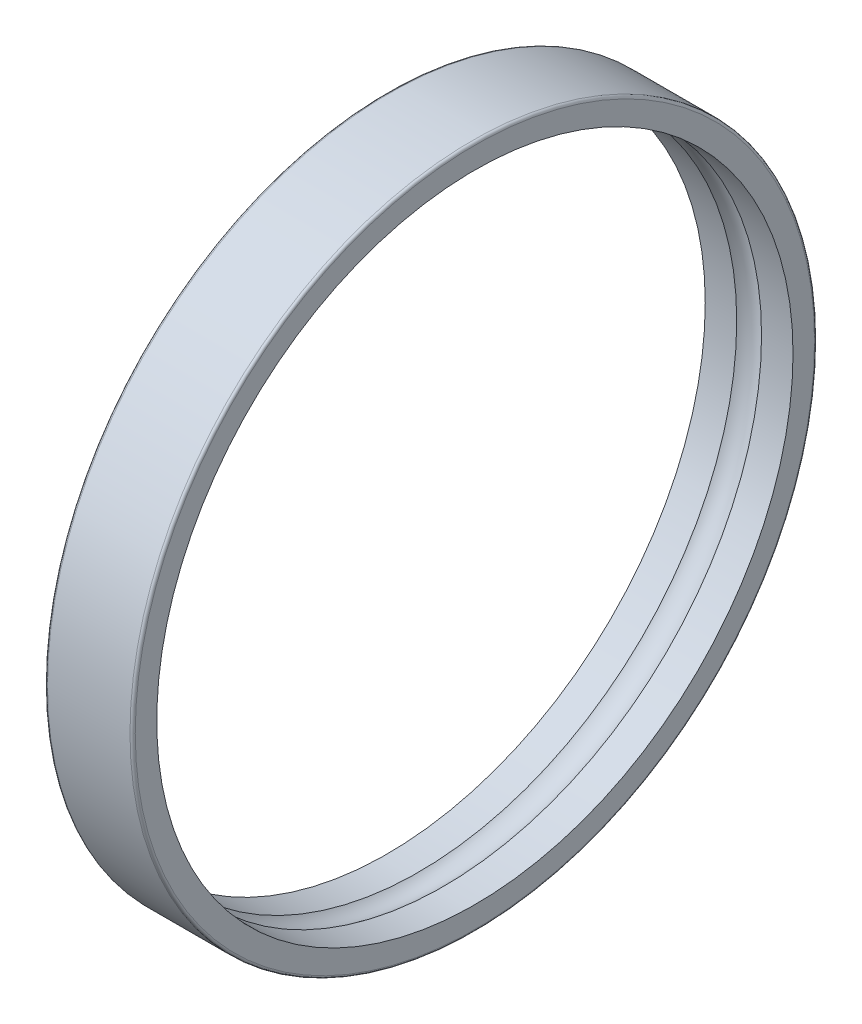
ISO-10303-21;
HEADER;
FILE_DESCRIPTION(('STEP AP214'),'2;1');
FILE_NAME('part.step','',(''),(''),'','','');
FILE_SCHEMA(('AUTOMOTIVE_DESIGN { 1 0 10303 214 1 1 1 1 }'));
ENDSEC;
DATA;
#1=APPLICATION_CONTEXT('core data for automotive mechanical design processes');
#2=APPLICATION_PROTOCOL_DEFINITION('international standard','automotive_design',2000,#1);
#3=PRODUCT_CONTEXT('',#1,'mechanical');
#4=PRODUCT('Part','Part','',(#3));
#5=PRODUCT_RELATED_PRODUCT_CATEGORY('part','',(#4));
#6=PRODUCT_DEFINITION_FORMATION('','',#4);
#7=PRODUCT_DEFINITION_CONTEXT('part definition',#1,'design');
#8=PRODUCT_DEFINITION('design','',#6,#7);
#9=PRODUCT_DEFINITION_SHAPE('','',#8);
#10=(LENGTH_UNIT() NAMED_UNIT(*) SI_UNIT(.MILLI.,.METRE.));
#11=(NAMED_UNIT(*) PLANE_ANGLE_UNIT() SI_UNIT($,.RADIAN.));
#12=(NAMED_UNIT(*) SI_UNIT($,.STERADIAN.) SOLID_ANGLE_UNIT());
#13=UNCERTAINTY_MEASURE_WITH_UNIT(LENGTH_MEASURE(1.E-05),#10,'distance_accuracy_value','');
#14=(GEOMETRIC_REPRESENTATION_CONTEXT(3) GLOBAL_UNCERTAINTY_ASSIGNED_CONTEXT((#13)) GLOBAL_UNIT_ASSIGNED_CONTEXT((#10,
#11,#12)) REPRESENTATION_CONTEXT('',''));
#15=CARTESIAN_POINT('',(0.,0.,0.));
#16=DIRECTION('',(0.,0.,1.));
#17=DIRECTION('',(1.,0.,0.));
#18=AXIS2_PLACEMENT_3D('',#15,#16,#17);
#19=CARTESIAN_POINT('',(0.,38.7,0.));
#20=DIRECTION('',(-1.,0.,0.));
#21=DIRECTION('',(0.,0.,1.));
#22=AXIS2_PLACEMENT_3D('',#19,#20,#21);
#23=PLANE('',#22);
#24=CARTESIAN_POINT('',(0.,0.,0.));
#25=DIRECTION('',(1.,0.,0.));
#26=DIRECTION('',(0.,0.,-1.));
#27=AXIS2_PLACEMENT_3D('',#24,#25,#26);
#28=CIRCLE('',#27,36.25);
#29=CARTESIAN_POINT('',(0.,0.,-36.25));
#30=VERTEX_POINT('',#29);
#31=EDGE_CURVE('E42',#30,#30,#28,.T.);
#32=ORIENTED_EDGE('',*,*,#31,.T.);
#33=EDGE_LOOP('',(#32));
#34=FACE_BOUND('',#33,.T.);
#35=CARTESIAN_POINT('',(0.,0.,0.));
#36=DIRECTION('',(1.,0.,0.));
#37=DIRECTION('',(0.,0.,-1.));
#38=AXIS2_PLACEMENT_3D('',#35,#36,#37);
#39=CIRCLE('',#38,38.7);
#40=CARTESIAN_POINT('',(0.,0.,-38.7));
#41=VERTEX_POINT('',#40);
#42=EDGE_CURVE('E41',#41,#41,#39,.T.);
#43=ORIENTED_EDGE('',*,*,#42,.F.);
#44=EDGE_LOOP('',(#43));
#45=FACE_BOUND('',#44,.T.);
#46=ADVANCED_FACE('F15',(#34,#45),#23,.T.);
#47=CARTESIAN_POINT('',(10.,0.,0.));
#48=DIRECTION('',(1.,0.,0.));
#49=DIRECTION('',(0.,0.,-1.));
#50=AXIS2_PLACEMENT_3D('',#47,#48,#49);
#51=CYLINDRICAL_SURFACE('',#50,36.25);
#52=CARTESIAN_POINT('',(3.5857864376269,0.,0.));
#53=DIRECTION('',(1.,0.,0.));
#54=DIRECTION('',(0.,0.,-1.));
#55=AXIS2_PLACEMENT_3D('',#52,#53,#54);
#56=CIRCLE('',#55,36.25);
#57=CARTESIAN_POINT('',(3.5857864376269,0.,-36.25));
#58=VERTEX_POINT('',#57);
#59=EDGE_CURVE('E36',#58,#58,#56,.T.);
#60=ORIENTED_EDGE('',*,*,#59,.T.);
#61=EDGE_LOOP('',(#60));
#62=FACE_BOUND('',#61,.T.);
#63=ORIENTED_EDGE('',*,*,#31,.F.);
#64=EDGE_LOOP('',(#63));
#65=FACE_BOUND('',#64,.T.);
#66=ADVANCED_FACE('F49',(#62,#65),#51,.F.);
#67=CARTESIAN_POINT('',(5.,0.,0.));
#68=DIRECTION('',(1.,0.,0.));
#69=DIRECTION('',(0.,0.,-1.));
#70=AXIS2_PLACEMENT_3D('',#67,#68,#69);
#71=TOROIDAL_SURFACE('',#70,34.5,2.25);
#72=ORIENTED_EDGE('',*,*,#59,.F.);
#73=EDGE_LOOP('',(#72));
#74=FACE_BOUND('',#73,.T.);
#75=CARTESIAN_POINT('',(6.4142135623731,0.,0.));
#76=DIRECTION('',(1.,0.,0.));
#77=DIRECTION('',(0.,0.,-1.));
#78=AXIS2_PLACEMENT_3D('',#75,#76,#77);
#79=CIRCLE('',#78,36.25);
#80=CARTESIAN_POINT('',(6.4142135623731,0.,-36.25));
#81=VERTEX_POINT('',#80);
#82=EDGE_CURVE('E34',#81,#81,#79,.T.);
#83=ORIENTED_EDGE('',*,*,#82,.T.);
#84=EDGE_LOOP('',(#83));
#85=FACE_BOUND('',#84,.T.);
#86=ADVANCED_FACE('F55',(#74,#85),#71,.F.);
#87=CARTESIAN_POINT('',(10.,0.,0.));
#88=DIRECTION('',(1.,0.,0.));
#89=DIRECTION('',(0.,0.,-1.));
#90=AXIS2_PLACEMENT_3D('',#87,#88,#89);
#91=CYLINDRICAL_SURFACE('',#90,36.25);
#92=CARTESIAN_POINT('',(10.,0.,0.));
#93=DIRECTION('',(1.,0.,0.));
#94=DIRECTION('',(0.,0.,-1.));
#95=AXIS2_PLACEMENT_3D('',#92,#93,#94);
#96=CIRCLE('',#95,36.25);
#97=CARTESIAN_POINT('',(10.,0.,-36.25));
#98=VERTEX_POINT('',#97);
#99=EDGE_CURVE('E28',#98,#98,#96,.T.);
#100=ORIENTED_EDGE('',*,*,#99,.T.);
#101=EDGE_LOOP('',(#100));
#102=FACE_BOUND('',#101,.T.);
#103=ORIENTED_EDGE('',*,*,#82,.F.);
#104=EDGE_LOOP('',(#103));
#105=FACE_BOUND('',#104,.T.);
#106=ADVANCED_FACE('F56',(#102,#105),#91,.F.);
#107=CARTESIAN_POINT('',(10.,36.25,0.));
#108=DIRECTION('',(1.,0.,0.));
#109=DIRECTION('',(0.,0.,-1.));
#110=AXIS2_PLACEMENT_3D('',#107,#108,#109);
#111=PLANE('',#110);
#112=CARTESIAN_POINT('',(10.,0.,0.));
#113=DIRECTION('',(1.,0.,0.));
#114=DIRECTION('',(0.,0.,-1.));
#115=AXIS2_PLACEMENT_3D('',#112,#113,#114);
#116=CIRCLE('',#115,38.7);
#117=CARTESIAN_POINT('',(10.,0.,-38.7));
#118=VERTEX_POINT('',#117);
#119=EDGE_CURVE('E27',#118,#118,#116,.T.);
#120=ORIENTED_EDGE('',*,*,#119,.T.);
#121=EDGE_LOOP('',(#120));
#122=FACE_BOUND('',#121,.T.);
#123=ORIENTED_EDGE('',*,*,#99,.F.);
#124=EDGE_LOOP('',(#123));
#125=FACE_BOUND('',#124,.T.);
#126=ADVANCED_FACE('F69',(#122,#125),#111,.T.);
#127=CARTESIAN_POINT('',(9.70000000000012,0.,0.));
#128=DIRECTION('',(1.,0.,0.));
#129=DIRECTION('',(0.,0.,-1.));
#130=AXIS2_PLACEMENT_3D('',#127,#128,#129);
#131=TOROIDAL_SURFACE('',#130,38.7,0.299999999999878);
#132=CARTESIAN_POINT('',(9.7,0.,0.));
#133=DIRECTION('',(1.,0.,0.));
#134=DIRECTION('',(0.,0.,-1.));
#135=AXIS2_PLACEMENT_3D('',#132,#133,#134);
#136=CIRCLE('',#135,39.);
#137=CARTESIAN_POINT('',(9.7,0.,-39.));
#138=VERTEX_POINT('',#137);
#139=EDGE_CURVE('E22',#138,#138,#136,.T.);
#140=ORIENTED_EDGE('',*,*,#139,.T.);
#141=EDGE_LOOP('',(#140));
#142=FACE_BOUND('',#141,.T.);
#143=ORIENTED_EDGE('',*,*,#119,.F.);
#144=EDGE_LOOP('',(#143));
#145=FACE_BOUND('',#144,.T.);
#146=ADVANCED_FACE('F75',(#142,#145),#131,.T.);
#147=CARTESIAN_POINT('',(10.,0.,0.));
#148=DIRECTION('',(1.,0.,0.));
#149=DIRECTION('',(0.,0.,-1.));
#150=AXIS2_PLACEMENT_3D('',#147,#148,#149);
#151=CYLINDRICAL_SURFACE('',#150,39.);
#152=CARTESIAN_POINT('',(0.300000000000001,0.,0.));
#153=DIRECTION('',(1.,0.,0.));
#154=DIRECTION('',(0.,0.,-1.));
#155=AXIS2_PLACEMENT_3D('',#152,#153,#154);
#156=CIRCLE('',#155,39.);
#157=CARTESIAN_POINT('',(0.300000000000001,0.,-39.));
#158=VERTEX_POINT('',#157);
#159=EDGE_CURVE('E10',#158,#158,#156,.T.);
#160=ORIENTED_EDGE('',*,*,#159,.T.);
#161=EDGE_LOOP('',(#160));
#162=FACE_BOUND('',#161,.T.);
#163=ORIENTED_EDGE('',*,*,#139,.F.);
#164=EDGE_LOOP('',(#163));
#165=FACE_BOUND('',#164,.T.);
#166=ADVANCED_FACE('F72',(#162,#165),#151,.T.);
#167=CARTESIAN_POINT('',(0.299999999999939,0.,0.));
#168=DIRECTION('',(1.,0.,0.));
#169=DIRECTION('',(0.,0.,-1.));
#170=AXIS2_PLACEMENT_3D('',#167,#168,#169);
#171=TOROIDAL_SURFACE('',#170,38.7,0.299999999999939);
#172=ORIENTED_EDGE('',*,*,#42,.T.);
#173=EDGE_LOOP('',(#172));
#174=FACE_BOUND('',#173,.T.);
#175=ORIENTED_EDGE('',*,*,#159,.F.);
#176=EDGE_LOOP('',(#175));
#177=FACE_BOUND('',#176,.T.);
#178=ADVANCED_FACE('F17',(#174,#177),#171,.T.);
#179=CLOSED_SHELL('',(#46,#66,#86,#106,#126,#146,#166,#178));
#180=MANIFOLD_SOLID_BREP('B1',#179);
#181=ADVANCED_BREP_SHAPE_REPRESENTATION('',(#18,#180),#14);
#182=SHAPE_DEFINITION_REPRESENTATION(#9,#181);
ENDSEC;
END-ISO-10303-21;
